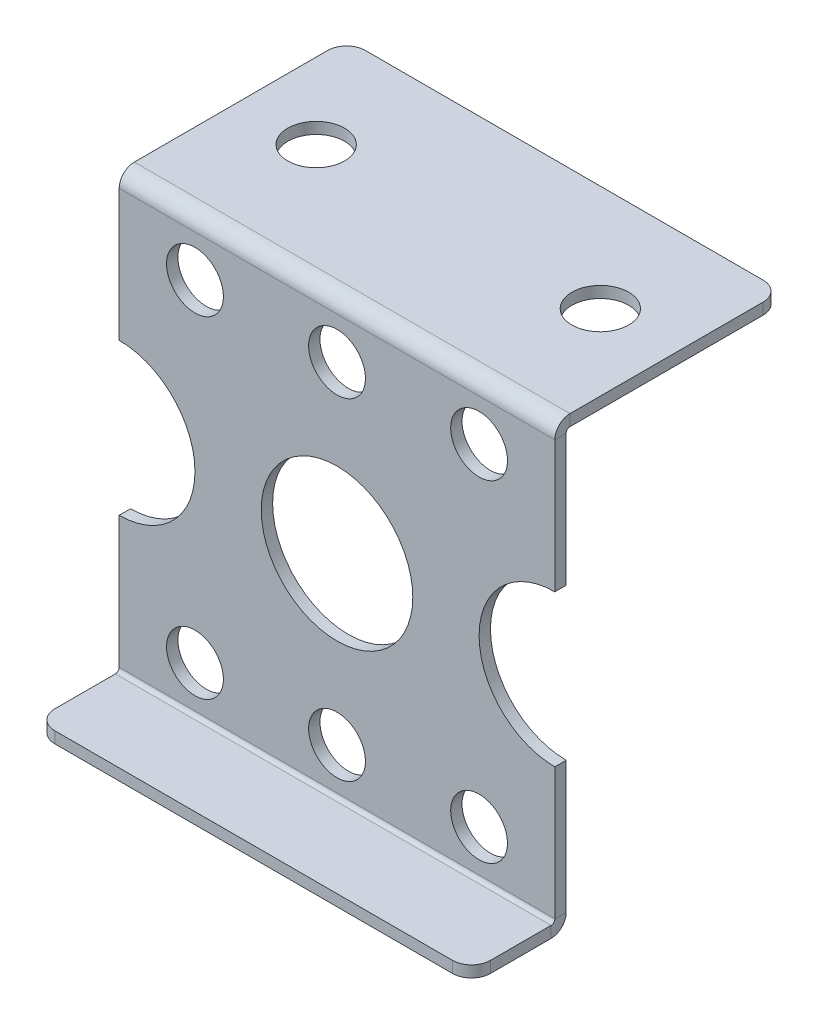
ISO-10303-21;
HEADER;
FILE_DESCRIPTION(('STEP AP214'),'2;1');
FILE_NAME('part.step','',(''),(''),'','','');
FILE_SCHEMA(('AUTOMOTIVE_DESIGN { 1 0 10303 214 1 1 1 1 }'));
ENDSEC;
DATA;
#1=APPLICATION_CONTEXT('core data for automotive mechanical design processes');
#2=APPLICATION_PROTOCOL_DEFINITION('international standard','automotive_design',2000,#1);
#3=PRODUCT_CONTEXT('',#1,'mechanical');
#4=PRODUCT('Part','Part','',(#3));
#5=PRODUCT_RELATED_PRODUCT_CATEGORY('part','',(#4));
#6=PRODUCT_DEFINITION_FORMATION('','',#4);
#7=PRODUCT_DEFINITION_CONTEXT('part definition',#1,'design');
#8=PRODUCT_DEFINITION('design','',#6,#7);
#9=PRODUCT_DEFINITION_SHAPE('','',#8);
#10=(LENGTH_UNIT() NAMED_UNIT(*) SI_UNIT(.MILLI.,.METRE.));
#11=(NAMED_UNIT(*) PLANE_ANGLE_UNIT() SI_UNIT($,.RADIAN.));
#12=(NAMED_UNIT(*) SI_UNIT($,.STERADIAN.) SOLID_ANGLE_UNIT());
#13=UNCERTAINTY_MEASURE_WITH_UNIT(LENGTH_MEASURE(1.E-05),#10,'distance_accuracy_value','');
#14=(GEOMETRIC_REPRESENTATION_CONTEXT(3) GLOBAL_UNCERTAINTY_ASSIGNED_CONTEXT((#13)) GLOBAL_UNIT_ASSIGNED_CONTEXT((#10,
#11,#12)) REPRESENTATION_CONTEXT('',''));
#15=CARTESIAN_POINT('',(0.,0.,0.));
#16=DIRECTION('',(0.,0.,1.));
#17=DIRECTION('',(1.,0.,0.));
#18=AXIS2_PLACEMENT_3D('',#15,#16,#17);
#19=CARTESIAN_POINT('',(11.5,0.,0.6));
#20=DIRECTION('',(0.,0.,1.));
#21=DIRECTION('',(1.,0.,0.));
#22=AXIS2_PLACEMENT_3D('',#19,#20,#21);
#23=PLANE('',#22);
#24=CARTESIAN_POINT('',(7.5,8.75,0.600000000000001));
#25=DIRECTION('',(0.,0.,-1.));
#26=DIRECTION('',(-1.,0.,0.));
#27=AXIS2_PLACEMENT_3D('',#24,#25,#26);
#28=CIRCLE('',#27,1.5);
#29=CARTESIAN_POINT('',(6.,8.75,0.600000000000001));
#30=VERTEX_POINT('',#29);
#31=EDGE_CURVE('E304',#30,#30,#28,.T.);
#32=ORIENTED_EDGE('',*,*,#31,.T.);
#33=EDGE_LOOP('',(#32));
#34=FACE_BOUND('',#33,.T.);
#35=CARTESIAN_POINT('',(0.,8.75,0.600000000000001));
#36=DIRECTION('',(0.,0.,-1.));
#37=DIRECTION('',(-1.,0.,0.));
#38=AXIS2_PLACEMENT_3D('',#35,#36,#37);
#39=CIRCLE('',#38,1.5);
#40=CARTESIAN_POINT('',(-1.5,8.75,0.600000000000001));
#41=VERTEX_POINT('',#40);
#42=EDGE_CURVE('E298',#41,#41,#39,.T.);
#43=ORIENTED_EDGE('',*,*,#42,.T.);
#44=EDGE_LOOP('',(#43));
#45=FACE_BOUND('',#44,.T.);
#46=CARTESIAN_POINT('',(-7.49999999999999,8.75,0.600000000000001));
#47=DIRECTION('',(0.,0.,-1.));
#48=DIRECTION('',(-1.,0.,0.));
#49=AXIS2_PLACEMENT_3D('',#46,#47,#48);
#50=CIRCLE('',#49,1.5);
#51=CARTESIAN_POINT('',(-8.99999999999999,8.75,0.600000000000001));
#52=VERTEX_POINT('',#51);
#53=EDGE_CURVE('E292',#52,#52,#50,.T.);
#54=ORIENTED_EDGE('',*,*,#53,.T.);
#55=EDGE_LOOP('',(#54));
#56=FACE_BOUND('',#55,.T.);
#57=CARTESIAN_POINT('',(-7.49999999999999,-8.75,0.600000000000001));
#58=DIRECTION('',(0.,0.,-1.));
#59=DIRECTION('',(-1.,0.,0.));
#60=AXIS2_PLACEMENT_3D('',#57,#58,#59);
#61=CIRCLE('',#60,1.5);
#62=CARTESIAN_POINT('',(-8.99999999999999,-8.75,0.600000000000001));
#63=VERTEX_POINT('',#62);
#64=EDGE_CURVE('E286',#63,#63,#61,.T.);
#65=ORIENTED_EDGE('',*,*,#64,.T.);
#66=EDGE_LOOP('',(#65));
#67=FACE_BOUND('',#66,.T.);
#68=CARTESIAN_POINT('',(0.,-8.75,0.600000000000001));
#69=DIRECTION('',(0.,0.,-1.));
#70=DIRECTION('',(-1.,0.,0.));
#71=AXIS2_PLACEMENT_3D('',#68,#69,#70);
#72=CIRCLE('',#71,1.5);
#73=CARTESIAN_POINT('',(-1.5,-8.75,0.600000000000001));
#74=VERTEX_POINT('',#73);
#75=EDGE_CURVE('E279',#74,#74,#72,.T.);
#76=ORIENTED_EDGE('',*,*,#75,.T.);
#77=EDGE_LOOP('',(#76));
#78=FACE_BOUND('',#77,.T.);
#79=CARTESIAN_POINT('',(7.5,-8.75,0.600000000000001));
#80=DIRECTION('',(0.,0.,-1.));
#81=DIRECTION('',(-1.,0.,0.));
#82=AXIS2_PLACEMENT_3D('',#79,#80,#81);
#83=CIRCLE('',#82,1.5);
#84=CARTESIAN_POINT('',(6.,-8.75,0.600000000000001));
#85=VERTEX_POINT('',#84);
#86=EDGE_CURVE('E309',#85,#85,#83,.T.);
#87=ORIENTED_EDGE('',*,*,#86,.T.);
#88=EDGE_LOOP('',(#87));
#89=FACE_BOUND('',#88,.T.);
#90=CARTESIAN_POINT('',(0.,0.,0.6));
#91=DIRECTION('',(0.,0.,1.));
#92=DIRECTION('',(1.,0.,0.));
#93=AXIS2_PLACEMENT_3D('',#90,#91,#92);
#94=CIRCLE('',#93,4.);
#95=CARTESIAN_POINT('',(4.,0.,0.6));
#96=VERTEX_POINT('',#95);
#97=EDGE_CURVE('E382',#96,#96,#94,.T.);
#98=ORIENTED_EDGE('',*,*,#97,.F.);
#99=EDGE_LOOP('',(#98));
#100=FACE_BOUND('',#99,.T.);
#101=DIRECTION('',(0.,-1.,0.));
#102=VECTOR('',#101,1.);
#103=CARTESIAN_POINT('',(-11.5,-4.,0.6));
#104=LINE('',#103,#102);
#105=CARTESIAN_POINT('',(-11.5,-4.,0.6));
#106=VERTEX_POINT('',#105);
#107=CARTESIAN_POINT('',(-11.5,-10.95,0.599999999999999));
#108=VERTEX_POINT('',#107);
#109=EDGE_CURVE('E379',#106,#108,#104,.T.);
#110=ORIENTED_EDGE('',*,*,#109,.T.);
#111=DIRECTION('',(1.,0.,0.));
#112=VECTOR('',#111,1.);
#113=CARTESIAN_POINT('',(11.5,-10.95,0.599999999999999));
#114=LINE('',#113,#112);
#115=CARTESIAN_POINT('',(11.5,-10.95,0.599999999999999));
#116=VERTEX_POINT('',#115);
#117=EDGE_CURVE('E269',#116,#108,#114,.F.);
#118=ORIENTED_EDGE('',*,*,#117,.F.);
#119=DIRECTION('',(0.,1.,0.));
#120=VECTOR('',#119,1.);
#121=CARTESIAN_POINT('',(11.5,-4.,0.6));
#122=LINE('',#121,#120);
#123=CARTESIAN_POINT('',(11.5,-4.,0.6));
#124=VERTEX_POINT('',#123);
#125=EDGE_CURVE('E365',#116,#124,#122,.T.);
#126=ORIENTED_EDGE('',*,*,#125,.T.);
#127=CARTESIAN_POINT('',(11.5,0.,0.6));
#128=DIRECTION('',(0.,0.,-1.));
#129=DIRECTION('',(1.,0.,0.));
#130=AXIS2_PLACEMENT_3D('',#127,#128,#129);
#131=CIRCLE('',#130,4.);
#132=CARTESIAN_POINT('',(11.5,4.,0.6));
#133=VERTEX_POINT('',#132);
#134=EDGE_CURVE('E367',#124,#133,#131,.T.);
#135=ORIENTED_EDGE('',*,*,#134,.T.);
#136=DIRECTION('',(0.,1.,0.));
#137=VECTOR('',#136,1.);
#138=CARTESIAN_POINT('',(11.5,11.75,0.6));
#139=LINE('',#138,#137);
#140=CARTESIAN_POINT('',(11.5,10.95,0.600000000000001));
#141=VERTEX_POINT('',#140);
#142=EDGE_CURVE('E371',#133,#141,#139,.T.);
#143=ORIENTED_EDGE('',*,*,#142,.T.);
#144=DIRECTION('',(1.,0.,0.));
#145=VECTOR('',#144,1.);
#146=CARTESIAN_POINT('',(11.5,10.95,0.600000000000001));
#147=LINE('',#146,#145);
#148=CARTESIAN_POINT('',(-11.5,10.95,0.6));
#149=VERTEX_POINT('',#148);
#150=EDGE_CURVE('E342',#141,#149,#147,.F.);
#151=ORIENTED_EDGE('',*,*,#150,.T.);
#152=DIRECTION('',(0.,-1.,0.));
#153=VECTOR('',#152,1.);
#154=CARTESIAN_POINT('',(-11.5,11.75,0.6));
#155=LINE('',#154,#153);
#156=CARTESIAN_POINT('',(-11.5,4.,0.6));
#157=VERTEX_POINT('',#156);
#158=EDGE_CURVE('E374',#149,#157,#155,.T.);
#159=ORIENTED_EDGE('',*,*,#158,.T.);
#160=CARTESIAN_POINT('',(-11.5,0.,0.6));
#161=DIRECTION('',(0.,0.,-1.));
#162=DIRECTION('',(1.,0.,0.));
#163=AXIS2_PLACEMENT_3D('',#160,#161,#162);
#164=CIRCLE('',#163,4.);
#165=EDGE_CURVE('E376',#157,#106,#164,.T.);
#166=ORIENTED_EDGE('',*,*,#165,.T.);
#167=EDGE_LOOP('',(#110,#118,#126,#135,#143,#151,#159,#166));
#168=FACE_BOUND('',#167,.T.);
#169=ADVANCED_FACE('F78',(#34,#45,#56,#67,#78,#89,#100,#168),#23,.T.);
#170=CARTESIAN_POINT('',(11.5,0.,0.));
#171=DIRECTION('',(0.,0.,1.));
#172=DIRECTION('',(1.,0.,0.));
#173=AXIS2_PLACEMENT_3D('',#170,#171,#172);
#174=PLANE('',#173);
#175=CARTESIAN_POINT('',(0.,0.,0.));
#176=DIRECTION('',(0.,0.,1.));
#177=DIRECTION('',(1.,0.,0.));
#178=AXIS2_PLACEMENT_3D('',#175,#176,#177);
#179=CIRCLE('',#178,4.);
#180=CARTESIAN_POINT('',(4.,0.,0.));
#181=VERTEX_POINT('',#180);
#182=EDGE_CURVE('E368',#181,#181,#179,.T.);
#183=ORIENTED_EDGE('',*,*,#182,.T.);
#184=EDGE_LOOP('',(#183));
#185=FACE_BOUND('',#184,.T.);
#186=CARTESIAN_POINT('',(7.5,-8.75,0.));
#187=DIRECTION('',(0.,0.,-1.));
#188=DIRECTION('',(-1.,0.,0.));
#189=AXIS2_PLACEMENT_3D('',#186,#187,#188);
#190=CIRCLE('',#189,1.5);
#191=CARTESIAN_POINT('',(6.,-8.75,0.));
#192=VERTEX_POINT('',#191);
#193=EDGE_CURVE('E282',#192,#192,#190,.T.);
#194=ORIENTED_EDGE('',*,*,#193,.F.);
#195=EDGE_LOOP('',(#194));
#196=FACE_BOUND('',#195,.T.);
#197=CARTESIAN_POINT('',(0.,-8.75,0.));
#198=DIRECTION('',(0.,0.,-1.));
#199=DIRECTION('',(-1.,0.,0.));
#200=AXIS2_PLACEMENT_3D('',#197,#198,#199);
#201=CIRCLE('',#200,1.5);
#202=CARTESIAN_POINT('',(-1.5,-8.75,0.));
#203=VERTEX_POINT('',#202);
#204=EDGE_CURVE('E283',#203,#203,#201,.T.);
#205=ORIENTED_EDGE('',*,*,#204,.F.);
#206=EDGE_LOOP('',(#205));
#207=FACE_BOUND('',#206,.T.);
#208=CARTESIAN_POINT('',(-7.49999999999999,-8.75,0.));
#209=DIRECTION('',(0.,0.,-1.));
#210=DIRECTION('',(-1.,0.,0.));
#211=AXIS2_PLACEMENT_3D('',#208,#209,#210);
#212=CIRCLE('',#211,1.5);
#213=CARTESIAN_POINT('',(-8.99999999999999,-8.75,0.));
#214=VERTEX_POINT('',#213);
#215=EDGE_CURVE('E289',#214,#214,#212,.T.);
#216=ORIENTED_EDGE('',*,*,#215,.F.);
#217=EDGE_LOOP('',(#216));
#218=FACE_BOUND('',#217,.T.);
#219=CARTESIAN_POINT('',(-7.49999999999999,8.75,0.));
#220=DIRECTION('',(0.,0.,-1.));
#221=DIRECTION('',(-1.,0.,0.));
#222=AXIS2_PLACEMENT_3D('',#219,#220,#221);
#223=CIRCLE('',#222,1.5);
#224=CARTESIAN_POINT('',(-8.99999999999999,8.75,0.));
#225=VERTEX_POINT('',#224);
#226=EDGE_CURVE('E295',#225,#225,#223,.T.);
#227=ORIENTED_EDGE('',*,*,#226,.F.);
#228=EDGE_LOOP('',(#227));
#229=FACE_BOUND('',#228,.T.);
#230=CARTESIAN_POINT('',(0.,8.75,0.));
#231=DIRECTION('',(0.,0.,-1.));
#232=DIRECTION('',(-1.,0.,0.));
#233=AXIS2_PLACEMENT_3D('',#230,#231,#232);
#234=CIRCLE('',#233,1.5);
#235=CARTESIAN_POINT('',(-1.5,8.75,0.));
#236=VERTEX_POINT('',#235);
#237=EDGE_CURVE('E301',#236,#236,#234,.T.);
#238=ORIENTED_EDGE('',*,*,#237,.F.);
#239=EDGE_LOOP('',(#238));
#240=FACE_BOUND('',#239,.T.);
#241=CARTESIAN_POINT('',(7.5,8.75,0.));
#242=DIRECTION('',(0.,0.,-1.));
#243=DIRECTION('',(-1.,0.,0.));
#244=AXIS2_PLACEMENT_3D('',#241,#242,#243);
#245=CIRCLE('',#244,1.5);
#246=CARTESIAN_POINT('',(6.,8.75,0.));
#247=VERTEX_POINT('',#246);
#248=EDGE_CURVE('E276',#247,#247,#245,.T.);
#249=ORIENTED_EDGE('',*,*,#248,.F.);
#250=EDGE_LOOP('',(#249));
#251=FACE_BOUND('',#250,.T.);
#252=DIRECTION('',(1.,0.,0.));
#253=VECTOR('',#252,1.);
#254=CARTESIAN_POINT('',(11.5,-10.95,0.));
#255=LINE('',#254,#253);
#256=CARTESIAN_POINT('',(11.5,-10.95,0.));
#257=VERTEX_POINT('',#256);
#258=CARTESIAN_POINT('',(-11.5,-10.95,0.));
#259=VERTEX_POINT('',#258);
#260=EDGE_CURVE('E225',#257,#259,#255,.F.);
#261=ORIENTED_EDGE('',*,*,#260,.T.);
#262=DIRECTION('',(0.,1.,0.));
#263=VECTOR('',#262,1.);
#264=CARTESIAN_POINT('',(-11.5,0.,0.));
#265=LINE('',#264,#263);
#266=CARTESIAN_POINT('',(-11.5,-4.,0.));
#267=VERTEX_POINT('',#266);
#268=EDGE_CURVE('E386',#267,#259,#265,.F.);
#269=ORIENTED_EDGE('',*,*,#268,.F.);
#270=CARTESIAN_POINT('',(-11.5,0.,0.));
#271=DIRECTION('',(0.,0.,-1.));
#272=DIRECTION('',(-1.,0.,0.));
#273=AXIS2_PLACEMENT_3D('',#270,#271,#272);
#274=CIRCLE('',#273,4.);
#275=CARTESIAN_POINT('',(-11.5,4.,0.));
#276=VERTEX_POINT('',#275);
#277=EDGE_CURVE('E389',#276,#267,#274,.T.);
#278=ORIENTED_EDGE('',*,*,#277,.F.);
#279=DIRECTION('',(0.,1.,0.));
#280=VECTOR('',#279,1.);
#281=CARTESIAN_POINT('',(-11.5,0.,0.));
#282=LINE('',#281,#280);
#283=CARTESIAN_POINT('',(-11.5,10.95,0.));
#284=VERTEX_POINT('',#283);
#285=EDGE_CURVE('E392',#284,#276,#282,.F.);
#286=ORIENTED_EDGE('',*,*,#285,.F.);
#287=DIRECTION('',(1.,0.,0.));
#288=VECTOR('',#287,1.);
#289=CARTESIAN_POINT('',(11.5,10.95,0.));
#290=LINE('',#289,#288);
#291=CARTESIAN_POINT('',(11.5,10.95,0.));
#292=VERTEX_POINT('',#291);
#293=EDGE_CURVE('E355',#292,#284,#290,.F.);
#294=ORIENTED_EDGE('',*,*,#293,.F.);
#295=DIRECTION('',(0.,1.,0.));
#296=VECTOR('',#295,1.);
#297=CARTESIAN_POINT('',(11.5,0.,0.));
#298=LINE('',#297,#296);
#299=CARTESIAN_POINT('',(11.5,4.,0.));
#300=VERTEX_POINT('',#299);
#301=EDGE_CURVE('E394',#300,#292,#298,.T.);
#302=ORIENTED_EDGE('',*,*,#301,.F.);
#303=CARTESIAN_POINT('',(11.5,0.,0.));
#304=DIRECTION('',(0.,0.,-1.));
#305=DIRECTION('',(-1.,0.,0.));
#306=AXIS2_PLACEMENT_3D('',#303,#304,#305);
#307=CIRCLE('',#306,4.);
#308=CARTESIAN_POINT('',(11.5,-4.,0.));
#309=VERTEX_POINT('',#308);
#310=EDGE_CURVE('E397',#309,#300,#307,.T.);
#311=ORIENTED_EDGE('',*,*,#310,.F.);
#312=DIRECTION('',(0.,1.,0.));
#313=VECTOR('',#312,1.);
#314=CARTESIAN_POINT('',(11.5,0.,0.));
#315=LINE('',#314,#313);
#316=EDGE_CURVE('E362',#257,#309,#315,.T.);
#317=ORIENTED_EDGE('',*,*,#316,.F.);
#318=EDGE_LOOP('',(#261,#269,#278,#286,#294,#302,#311,#317));
#319=FACE_BOUND('',#318,.T.);
#320=ADVANCED_FACE('F476',(#185,#196,#207,#218,#229,#240,#251,#319),#174,.F.);
#321=CARTESIAN_POINT('',(11.5,-4.,0.6));
#322=DIRECTION('',(1.,0.,0.));
#323=DIRECTION('',(0.,1.,0.));
#324=AXIS2_PLACEMENT_3D('',#321,#322,#323);
#325=PLANE('',#324);
#326=ORIENTED_EDGE('',*,*,#125,.F.);
#327=DIRECTION('',(0.,0.,-1.));
#328=VECTOR('',#327,1.);
#329=CARTESIAN_POINT('',(11.5,-10.95,0.599999999999999));
#330=LINE('',#329,#328);
#331=EDGE_CURVE('E265',#116,#257,#330,.T.);
#332=ORIENTED_EDGE('',*,*,#331,.T.);
#333=ORIENTED_EDGE('',*,*,#316,.T.);
#334=DIRECTION('',(0.,0.,1.));
#335=VECTOR('',#334,1.);
#336=CARTESIAN_POINT('',(11.5,-4.,0.6));
#337=LINE('',#336,#335);
#338=EDGE_CURVE('E409',#309,#124,#337,.T.);
#339=ORIENTED_EDGE('',*,*,#338,.T.);
#340=EDGE_LOOP('',(#326,#332,#333,#339));
#341=FACE_BOUND('',#340,.T.);
#342=ADVANCED_FACE('F481',(#341),#325,.T.);
#343=CARTESIAN_POINT('',(11.5,11.75,0.6));
#344=DIRECTION('',(1.,0.,0.));
#345=DIRECTION('',(0.,1.,0.));
#346=AXIS2_PLACEMENT_3D('',#343,#344,#345);
#347=PLANE('',#346);
#348=ORIENTED_EDGE('',*,*,#301,.T.);
#349=DIRECTION('',(0.,0.,1.));
#350=VECTOR('',#349,1.);
#351=CARTESIAN_POINT('',(11.5,10.95,0.));
#352=LINE('',#351,#350);
#353=EDGE_CURVE('E349',#292,#141,#352,.T.);
#354=ORIENTED_EDGE('',*,*,#353,.T.);
#355=ORIENTED_EDGE('',*,*,#142,.F.);
#356=DIRECTION('',(0.,0.,1.));
#357=VECTOR('',#356,1.);
#358=CARTESIAN_POINT('',(11.5,4.,0.6));
#359=LINE('',#358,#357);
#360=EDGE_CURVE('E407',#300,#133,#359,.T.);
#361=ORIENTED_EDGE('',*,*,#360,.F.);
#362=EDGE_LOOP('',(#348,#354,#355,#361));
#363=FACE_BOUND('',#362,.T.);
#364=ADVANCED_FACE('F486',(#363),#347,.T.);
#365=CARTESIAN_POINT('',(11.5,0.,0.6));
#366=DIRECTION('',(0.,0.,1.));
#367=DIRECTION('',(1.,0.,0.));
#368=AXIS2_PLACEMENT_3D('',#365,#366,#367);
#369=CYLINDRICAL_SURFACE('',#368,4.);
#370=ORIENTED_EDGE('',*,*,#338,.F.);
#371=ORIENTED_EDGE('',*,*,#310,.T.);
#372=ORIENTED_EDGE('',*,*,#360,.T.);
#373=ORIENTED_EDGE('',*,*,#134,.F.);
#374=EDGE_LOOP('',(#370,#371,#372,#373));
#375=FACE_BOUND('',#374,.T.);
#376=ADVANCED_FACE('F564',(#375),#369,.F.);
#377=CARTESIAN_POINT('',(-11.5,11.75,0.6));
#378=DIRECTION('',(-1.,0.,0.));
#379=DIRECTION('',(0.,-1.,0.));
#380=AXIS2_PLACEMENT_3D('',#377,#378,#379);
#381=PLANE('',#380);
#382=DIRECTION('',(0.,0.,1.));
#383=VECTOR('',#382,1.);
#384=CARTESIAN_POINT('',(-11.5,10.95,0.));
#385=LINE('',#384,#383);
#386=EDGE_CURVE('E359',#284,#149,#385,.T.);
#387=ORIENTED_EDGE('',*,*,#386,.F.);
#388=ORIENTED_EDGE('',*,*,#285,.T.);
#389=DIRECTION('',(0.,0.,1.));
#390=VECTOR('',#389,1.);
#391=CARTESIAN_POINT('',(-11.5,4.,0.6));
#392=LINE('',#391,#390);
#393=EDGE_CURVE('E404',#276,#157,#392,.T.);
#394=ORIENTED_EDGE('',*,*,#393,.T.);
#395=ORIENTED_EDGE('',*,*,#158,.F.);
#396=EDGE_LOOP('',(#387,#388,#394,#395));
#397=FACE_BOUND('',#396,.T.);
#398=ADVANCED_FACE('F498',(#397),#381,.T.);
#399=CARTESIAN_POINT('',(-11.5,0.,0.6));
#400=DIRECTION('',(0.,0.,1.));
#401=DIRECTION('',(1.,0.,0.));
#402=AXIS2_PLACEMENT_3D('',#399,#400,#401);
#403=CYLINDRICAL_SURFACE('',#402,4.);
#404=ORIENTED_EDGE('',*,*,#393,.F.);
#405=ORIENTED_EDGE('',*,*,#277,.T.);
#406=DIRECTION('',(0.,0.,1.));
#407=VECTOR('',#406,1.);
#408=CARTESIAN_POINT('',(-11.5,-4.,0.6));
#409=LINE('',#408,#407);
#410=EDGE_CURVE('E385',#267,#106,#409,.T.);
#411=ORIENTED_EDGE('',*,*,#410,.T.);
#412=ORIENTED_EDGE('',*,*,#165,.F.);
#413=EDGE_LOOP('',(#404,#405,#411,#412));
#414=FACE_BOUND('',#413,.T.);
#415=ADVANCED_FACE('F472',(#414),#403,.F.);
#416=CARTESIAN_POINT('',(-11.5,-4.,0.6));
#417=DIRECTION('',(-1.,0.,0.));
#418=DIRECTION('',(0.,-1.,0.));
#419=AXIS2_PLACEMENT_3D('',#416,#417,#418);
#420=PLANE('',#419);
#421=DIRECTION('',(0.,0.,-1.));
#422=VECTOR('',#421,1.);
#423=CARTESIAN_POINT('',(-11.5,-10.95,0.599999999999999));
#424=LINE('',#423,#422);
#425=EDGE_CURVE('E273',#108,#259,#424,.T.);
#426=ORIENTED_EDGE('',*,*,#425,.F.);
#427=ORIENTED_EDGE('',*,*,#109,.F.);
#428=ORIENTED_EDGE('',*,*,#410,.F.);
#429=ORIENTED_EDGE('',*,*,#268,.T.);
#430=EDGE_LOOP('',(#426,#427,#428,#429));
#431=FACE_BOUND('',#430,.T.);
#432=ADVANCED_FACE('F464',(#431),#420,.T.);
#433=CARTESIAN_POINT('',(0.,0.,0.6));
#434=DIRECTION('',(0.,0.,1.));
#435=DIRECTION('',(1.,0.,0.));
#436=AXIS2_PLACEMENT_3D('',#433,#434,#435);
#437=CYLINDRICAL_SURFACE('',#436,4.);
#438=ORIENTED_EDGE('',*,*,#97,.T.);
#439=EDGE_LOOP('',(#438));
#440=FACE_BOUND('',#439,.T.);
#441=ORIENTED_EDGE('',*,*,#182,.F.);
#442=EDGE_LOOP('',(#441));
#443=FACE_BOUND('',#442,.T.);
#444=ADVANCED_FACE('F559',(#440,#443),#437,.F.);
#445=CARTESIAN_POINT('',(-11.5,10.95,-0.199999999999999));
#446=DIRECTION('',(-1.,0.,0.));
#447=DIRECTION('',(0.,0.,1.));
#448=AXIS2_PLACEMENT_3D('',#445,#446,#447);
#449=PLANE('',#448);
#450=DIRECTION('',(0.,-1.,0.));
#451=VECTOR('',#450,1.);
#452=CARTESIAN_POINT('',(-11.5,11.75,-0.199999999999997));
#453=LINE('',#452,#451);
#454=CARTESIAN_POINT('',(-11.5,11.15,-0.199999999999999));
#455=VERTEX_POINT('',#454);
#456=CARTESIAN_POINT('',(-11.5,11.75,-0.199999999999997));
#457=VERTEX_POINT('',#456);
#458=EDGE_CURVE('E312',#455,#457,#453,.F.);
#459=ORIENTED_EDGE('',*,*,#458,.F.);
#460=CARTESIAN_POINT('',(-11.5,10.95,-0.199999999999999));
#461=DIRECTION('',(1.,0.,0.));
#462=DIRECTION('',(0.,0.,-1.));
#463=AXIS2_PLACEMENT_3D('',#460,#461,#462);
#464=CIRCLE('',#463,0.200000000000001);
#465=EDGE_CURVE('E352',#284,#455,#464,.F.);
#466=ORIENTED_EDGE('',*,*,#465,.F.);
#467=ORIENTED_EDGE('',*,*,#386,.T.);
#468=CARTESIAN_POINT('',(-11.5,10.95,-0.199999999999999));
#469=DIRECTION('',(1.,0.,0.));
#470=DIRECTION('',(0.,0.,-1.));
#471=AXIS2_PLACEMENT_3D('',#468,#469,#470);
#472=CIRCLE('',#471,0.8);
#473=EDGE_CURVE('E345',#149,#457,#472,.F.);
#474=ORIENTED_EDGE('',*,*,#473,.T.);
#475=EDGE_LOOP('',(#459,#466,#467,#474));
#476=FACE_BOUND('',#475,.T.);
#477=ADVANCED_FACE('F501',(#476),#449,.T.);
#478=CARTESIAN_POINT('',(11.5,10.95,-0.199999999999999));
#479=DIRECTION('',(-1.,0.,0.));
#480=DIRECTION('',(0.,0.,1.));
#481=AXIS2_PLACEMENT_3D('',#478,#479,#480);
#482=PLANE('',#481);
#483=CARTESIAN_POINT('',(11.5,10.95,-0.199999999999999));
#484=DIRECTION('',(1.,0.,0.));
#485=DIRECTION('',(0.,0.,-1.));
#486=AXIS2_PLACEMENT_3D('',#483,#484,#485);
#487=CIRCLE('',#486,0.200000000000001);
#488=CARTESIAN_POINT('',(11.5,11.15,-0.199999999999999));
#489=VERTEX_POINT('',#488);
#490=EDGE_CURVE('E317',#489,#292,#487,.T.);
#491=ORIENTED_EDGE('',*,*,#490,.F.);
#492=DIRECTION('',(0.,-1.,0.));
#493=VECTOR('',#492,1.);
#494=CARTESIAN_POINT('',(11.5,11.15,-0.199999999999999));
#495=LINE('',#494,#493);
#496=CARTESIAN_POINT('',(11.5,11.75,-0.199999999999997));
#497=VERTEX_POINT('',#496);
#498=EDGE_CURVE('E335',#489,#497,#495,.F.);
#499=ORIENTED_EDGE('',*,*,#498,.T.);
#500=CARTESIAN_POINT('',(11.5,10.95,-0.199999999999999));
#501=DIRECTION('',(1.,0.,0.));
#502=DIRECTION('',(0.,0.,-1.));
#503=AXIS2_PLACEMENT_3D('',#500,#501,#502);
#504=CIRCLE('',#503,0.8);
#505=EDGE_CURVE('E346',#497,#141,#504,.T.);
#506=ORIENTED_EDGE('',*,*,#505,.T.);
#507=ORIENTED_EDGE('',*,*,#353,.F.);
#508=EDGE_LOOP('',(#491,#499,#506,#507));
#509=FACE_BOUND('',#508,.T.);
#510=ADVANCED_FACE('F489',(#509),#482,.F.);
#511=CARTESIAN_POINT('',(11.5,10.95,-0.199999999999999));
#512=DIRECTION('',(1.,0.,0.));
#513=DIRECTION('',(0.,1.,0.));
#514=AXIS2_PLACEMENT_3D('',#511,#512,#513);
#515=CYLINDRICAL_SURFACE('',#514,0.8);
#516=ORIENTED_EDGE('',*,*,#150,.F.);
#517=ORIENTED_EDGE('',*,*,#505,.F.);
#518=DIRECTION('',(1.,0.,0.));
#519=VECTOR('',#518,1.);
#520=CARTESIAN_POINT('',(-11.5,11.75,-0.199999999999997));
#521=LINE('',#520,#519);
#522=EDGE_CURVE('E332',#497,#457,#521,.F.);
#523=ORIENTED_EDGE('',*,*,#522,.T.);
#524=ORIENTED_EDGE('',*,*,#473,.F.);
#525=EDGE_LOOP('',(#516,#517,#523,#524));
#526=FACE_BOUND('',#525,.T.);
#527=ADVANCED_FACE('F503',(#526),#515,.T.);
#528=CARTESIAN_POINT('',(11.5,10.95,-0.199999999999999));
#529=DIRECTION('',(1.,0.,0.));
#530=DIRECTION('',(0.,1.,0.));
#531=AXIS2_PLACEMENT_3D('',#528,#529,#530);
#532=CYLINDRICAL_SURFACE('',#531,0.200000000000001);
#533=ORIENTED_EDGE('',*,*,#293,.T.);
#534=ORIENTED_EDGE('',*,*,#465,.T.);
#535=DIRECTION('',(1.,0.,0.));
#536=VECTOR('',#535,1.);
#537=CARTESIAN_POINT('',(-11.5,11.15,-0.199999999999999));
#538=LINE('',#537,#536);
#539=EDGE_CURVE('E338',#455,#489,#538,.T.);
#540=ORIENTED_EDGE('',*,*,#539,.T.);
#541=ORIENTED_EDGE('',*,*,#490,.T.);
#542=EDGE_LOOP('',(#533,#534,#540,#541));
#543=FACE_BOUND('',#542,.T.);
#544=ADVANCED_FACE('F493',(#543),#532,.F.);
#545=CARTESIAN_POINT('',(11.5,11.75,-11.4));
#546=DIRECTION('',(-1.,0.,0.));
#547=DIRECTION('',(0.,0.,1.));
#548=AXIS2_PLACEMENT_3D('',#545,#546,#547);
#549=PLANE('',#548);
#550=DIRECTION('',(0.,0.,1.));
#551=VECTOR('',#550,1.);
#552=CARTESIAN_POINT('',(11.5,11.15,-11.4));
#553=LINE('',#552,#551);
#554=CARTESIAN_POINT('',(11.5,11.15,-10.4));
#555=VERTEX_POINT('',#554);
#556=EDGE_CURVE('E329',#489,#555,#553,.F.);
#557=ORIENTED_EDGE('',*,*,#556,.T.);
#558=DIRECTION('',(0.,-1.,0.));
#559=VECTOR('',#558,1.);
#560=CARTESIAN_POINT('',(11.5,11.75,-10.4));
#561=LINE('',#560,#559);
#562=CARTESIAN_POINT('',(11.5,11.75,-10.4));
#563=VERTEX_POINT('',#562);
#564=EDGE_CURVE('E421',#555,#563,#561,.F.);
#565=ORIENTED_EDGE('',*,*,#564,.T.);
#566=DIRECTION('',(0.,0.,-1.));
#567=VECTOR('',#566,1.);
#568=CARTESIAN_POINT('',(11.5,11.75,0.));
#569=LINE('',#568,#567);
#570=EDGE_CURVE('E321',#497,#563,#569,.T.);
#571=ORIENTED_EDGE('',*,*,#570,.F.);
#572=ORIENTED_EDGE('',*,*,#498,.F.);
#573=EDGE_LOOP('',(#557,#565,#571,#572));
#574=FACE_BOUND('',#573,.T.);
#575=ADVANCED_FACE('F511',(#574),#549,.F.);
#576=CARTESIAN_POINT('',(-11.5,11.75,0.));
#577=DIRECTION('',(1.,0.,0.));
#578=DIRECTION('',(0.,0.,-1.));
#579=AXIS2_PLACEMENT_3D('',#576,#577,#578);
#580=PLANE('',#579);
#581=DIRECTION('',(0.,0.,1.));
#582=VECTOR('',#581,1.);
#583=CARTESIAN_POINT('',(-11.5,11.75,0.));
#584=LINE('',#583,#582);
#585=CARTESIAN_POINT('',(-11.5,11.75,-10.4));
#586=VERTEX_POINT('',#585);
#587=EDGE_CURVE('E315',#586,#457,#584,.T.);
#588=ORIENTED_EDGE('',*,*,#587,.F.);
#589=DIRECTION('',(0.,-1.,0.));
#590=VECTOR('',#589,1.);
#591=CARTESIAN_POINT('',(-11.5,11.75,-10.4));
#592=LINE('',#591,#590);
#593=CARTESIAN_POINT('',(-11.5,11.15,-10.4));
#594=VERTEX_POINT('',#593);
#595=EDGE_CURVE('E427',#586,#594,#592,.T.);
#596=ORIENTED_EDGE('',*,*,#595,.T.);
#597=DIRECTION('',(0.,0.,-1.));
#598=VECTOR('',#597,1.);
#599=CARTESIAN_POINT('',(-11.5,11.15,0.));
#600=LINE('',#599,#598);
#601=EDGE_CURVE('E324',#594,#455,#600,.F.);
#602=ORIENTED_EDGE('',*,*,#601,.T.);
#603=ORIENTED_EDGE('',*,*,#458,.T.);
#604=EDGE_LOOP('',(#588,#596,#602,#603));
#605=FACE_BOUND('',#604,.T.);
#606=ADVANCED_FACE('F527',(#605),#580,.F.);
#607=CARTESIAN_POINT('',(0.,11.75,0.));
#608=DIRECTION('',(0.,-1.,0.));
#609=DIRECTION('',(0.,0.,-1.));
#610=AXIS2_PLACEMENT_3D('',#607,#608,#609);
#611=PLANE('',#610);
#612=CARTESIAN_POINT('',(7.5,11.7500000000001,-5.80000000000001));
#613=DIRECTION('',(0.,-1.,0.));
#614=DIRECTION('',(0.,0.,-1.));
#615=AXIS2_PLACEMENT_3D('',#612,#613,#614);
#616=CIRCLE('',#615,1.5);
#617=CARTESIAN_POINT('',(7.5,11.7500000000001,-7.30000000000001));
#618=VERTEX_POINT('',#617);
#619=EDGE_CURVE('E262',#618,#618,#616,.T.);
#620=ORIENTED_EDGE('',*,*,#619,.T.);
#621=EDGE_LOOP('',(#620));
#622=FACE_BOUND('',#621,.T.);
#623=CARTESIAN_POINT('',(-7.5,11.7500000000001,-5.80000000000001));
#624=DIRECTION('',(0.,-1.,0.));
#625=DIRECTION('',(0.,0.,1.));
#626=AXIS2_PLACEMENT_3D('',#623,#624,#625);
#627=CIRCLE('',#626,1.5);
#628=CARTESIAN_POINT('',(-7.5,11.7500000000001,-4.30000000000001));
#629=VERTEX_POINT('',#628);
#630=EDGE_CURVE('E993',#629,#629,#627,.T.);
#631=ORIENTED_EDGE('',*,*,#630,.T.);
#632=EDGE_LOOP('',(#631));
#633=FACE_BOUND('',#632,.T.);
#634=ORIENTED_EDGE('',*,*,#570,.T.);
#635=CARTESIAN_POINT('',(10.5,11.75,-10.4));
#636=DIRECTION('',(0.,-1.,0.));
#637=DIRECTION('',(0.,0.,-1.));
#638=AXIS2_PLACEMENT_3D('',#635,#636,#637);
#639=CIRCLE('',#638,1.);
#640=CARTESIAN_POINT('',(10.5,11.75,-11.4));
#641=VERTEX_POINT('',#640);
#642=EDGE_CURVE('E425',#563,#641,#639,.F.);
#643=ORIENTED_EDGE('',*,*,#642,.T.);
#644=DIRECTION('',(-1.,0.,0.));
#645=VECTOR('',#644,1.);
#646=CARTESIAN_POINT('',(0.,11.75,-11.4));
#647=LINE('',#646,#645);
#648=CARTESIAN_POINT('',(-10.5,11.75,-11.4));
#649=VERTEX_POINT('',#648);
#650=EDGE_CURVE('E318',#641,#649,#647,.T.);
#651=ORIENTED_EDGE('',*,*,#650,.T.);
#652=CARTESIAN_POINT('',(-10.5,11.75,-10.4));
#653=DIRECTION('',(0.,-1.,0.));
#654=DIRECTION('',(0.,0.,-1.));
#655=AXIS2_PLACEMENT_3D('',#652,#653,#654);
#656=CIRCLE('',#655,1.);
#657=EDGE_CURVE('E423',#649,#586,#656,.F.);
#658=ORIENTED_EDGE('',*,*,#657,.T.);
#659=ORIENTED_EDGE('',*,*,#587,.T.);
#660=ORIENTED_EDGE('',*,*,#522,.F.);
#661=EDGE_LOOP('',(#634,#643,#651,#658,#659,#660));
#662=FACE_BOUND('',#661,.T.);
#663=ADVANCED_FACE('F507',(#622,#633,#662),#611,.F.);
#664=CARTESIAN_POINT('',(0.,11.15,0.));
#665=DIRECTION('',(0.,-1.,0.));
#666=DIRECTION('',(0.,0.,-1.));
#667=AXIS2_PLACEMENT_3D('',#664,#665,#666);
#668=PLANE('',#667);
#669=CARTESIAN_POINT('',(7.5,11.15,-5.80000000000001));
#670=DIRECTION('',(0.,-1.,0.));
#671=DIRECTION('',(0.,0.,-1.));
#672=AXIS2_PLACEMENT_3D('',#669,#670,#671);
#673=CIRCLE('',#672,1.5);
#674=CARTESIAN_POINT('',(7.5,11.15,-7.30000000000001));
#675=VERTEX_POINT('',#674);
#676=EDGE_CURVE('E998',#675,#675,#673,.T.);
#677=ORIENTED_EDGE('',*,*,#676,.F.);
#678=EDGE_LOOP('',(#677));
#679=FACE_BOUND('',#678,.T.);
#680=CARTESIAN_POINT('',(-7.5,11.15,-5.80000000000001));
#681=DIRECTION('',(0.,-1.,0.));
#682=DIRECTION('',(0.,0.,1.));
#683=AXIS2_PLACEMENT_3D('',#680,#681,#682);
#684=CIRCLE('',#683,1.5);
#685=CARTESIAN_POINT('',(-7.5,11.15,-4.30000000000001));
#686=VERTEX_POINT('',#685);
#687=EDGE_CURVE('E996',#686,#686,#684,.T.);
#688=ORIENTED_EDGE('',*,*,#687,.F.);
#689=EDGE_LOOP('',(#688));
#690=FACE_BOUND('',#689,.T.);
#691=DIRECTION('',(1.,0.,0.));
#692=VECTOR('',#691,1.);
#693=CARTESIAN_POINT('',(-11.5,11.15,-11.4));
#694=LINE('',#693,#692);
#695=CARTESIAN_POINT('',(10.5,11.15,-11.4));
#696=VERTEX_POINT('',#695);
#697=CARTESIAN_POINT('',(-10.5,11.15,-11.4));
#698=VERTEX_POINT('',#697);
#699=EDGE_CURVE('E326',#696,#698,#694,.F.);
#700=ORIENTED_EDGE('',*,*,#699,.F.);
#701=CARTESIAN_POINT('',(10.5,11.15,-10.4));
#702=DIRECTION('',(0.,-1.,0.));
#703=DIRECTION('',(0.,0.,-1.));
#704=AXIS2_PLACEMENT_3D('',#701,#702,#703);
#705=CIRCLE('',#704,1.);
#706=EDGE_CURVE('E419',#696,#555,#705,.T.);
#707=ORIENTED_EDGE('',*,*,#706,.T.);
#708=ORIENTED_EDGE('',*,*,#556,.F.);
#709=ORIENTED_EDGE('',*,*,#539,.F.);
#710=ORIENTED_EDGE('',*,*,#601,.F.);
#711=CARTESIAN_POINT('',(-10.5,11.15,-10.4));
#712=DIRECTION('',(0.,-1.,0.));
#713=DIRECTION('',(0.,0.,-1.));
#714=AXIS2_PLACEMENT_3D('',#711,#712,#713);
#715=CIRCLE('',#714,1.);
#716=EDGE_CURVE('E417',#594,#698,#715,.T.);
#717=ORIENTED_EDGE('',*,*,#716,.T.);
#718=EDGE_LOOP('',(#700,#707,#708,#709,#710,#717));
#719=FACE_BOUND('',#718,.T.);
#720=ADVANCED_FACE('F530',(#679,#690,#719),#668,.T.);
#721=CARTESIAN_POINT('',(-11.5,11.75,-11.4));
#722=DIRECTION('',(0.,0.,1.));
#723=DIRECTION('',(0.,-1.,0.));
#724=AXIS2_PLACEMENT_3D('',#721,#722,#723);
#725=PLANE('',#724);
#726=ORIENTED_EDGE('',*,*,#650,.F.);
#727=DIRECTION('',(0.,-1.,0.));
#728=VECTOR('',#727,1.);
#729=CARTESIAN_POINT('',(10.5,11.75,-11.4));
#730=LINE('',#729,#728);
#731=EDGE_CURVE('E414',#641,#696,#730,.T.);
#732=ORIENTED_EDGE('',*,*,#731,.T.);
#733=ORIENTED_EDGE('',*,*,#699,.T.);
#734=DIRECTION('',(0.,-1.,0.));
#735=VECTOR('',#734,1.);
#736=CARTESIAN_POINT('',(-10.5,11.75,-11.4));
#737=LINE('',#736,#735);
#738=EDGE_CURVE('E412',#698,#649,#737,.F.);
#739=ORIENTED_EDGE('',*,*,#738,.T.);
#740=EDGE_LOOP('',(#726,#732,#733,#739));
#741=FACE_BOUND('',#740,.T.);
#742=ADVANCED_FACE('F520',(#741),#725,.F.);
#743=CARTESIAN_POINT('',(7.5,-8.75,0.600000000000001));
#744=DIRECTION('',(0.,0.,-1.));
#745=DIRECTION('',(-1.,0.,0.));
#746=AXIS2_PLACEMENT_3D('',#743,#744,#745);
#747=CYLINDRICAL_SURFACE('',#746,1.5);
#748=ORIENTED_EDGE('',*,*,#86,.F.);
#749=EDGE_LOOP('',(#748));
#750=FACE_BOUND('',#749,.T.);
#751=ORIENTED_EDGE('',*,*,#193,.T.);
#752=EDGE_LOOP('',(#751));
#753=FACE_BOUND('',#752,.T.);
#754=ADVANCED_FACE('F538',(#750,#753),#747,.F.);
#755=CARTESIAN_POINT('',(0.,-8.75,0.600000000000001));
#756=DIRECTION('',(0.,0.,-1.));
#757=DIRECTION('',(-1.,0.,0.));
#758=AXIS2_PLACEMENT_3D('',#755,#756,#757);
#759=CYLINDRICAL_SURFACE('',#758,1.5);
#760=ORIENTED_EDGE('',*,*,#75,.F.);
#761=EDGE_LOOP('',(#760));
#762=FACE_BOUND('',#761,.T.);
#763=ORIENTED_EDGE('',*,*,#204,.T.);
#764=EDGE_LOOP('',(#763));
#765=FACE_BOUND('',#764,.T.);
#766=ADVANCED_FACE('F813',(#762,#765),#759,.F.);
#767=CARTESIAN_POINT('',(-7.49999999999999,-8.75,0.600000000000001));
#768=DIRECTION('',(0.,0.,-1.));
#769=DIRECTION('',(-1.,0.,0.));
#770=AXIS2_PLACEMENT_3D('',#767,#768,#769);
#771=CYLINDRICAL_SURFACE('',#770,1.5);
#772=ORIENTED_EDGE('',*,*,#64,.F.);
#773=EDGE_LOOP('',(#772));
#774=FACE_BOUND('',#773,.T.);
#775=ORIENTED_EDGE('',*,*,#215,.T.);
#776=EDGE_LOOP('',(#775));
#777=FACE_BOUND('',#776,.T.);
#778=ADVANCED_FACE('F802',(#774,#777),#771,.F.);
#779=CARTESIAN_POINT('',(-7.49999999999999,8.75,0.600000000000001));
#780=DIRECTION('',(0.,0.,-1.));
#781=DIRECTION('',(-1.,0.,0.));
#782=AXIS2_PLACEMENT_3D('',#779,#780,#781);
#783=CYLINDRICAL_SURFACE('',#782,1.5);
#784=ORIENTED_EDGE('',*,*,#53,.F.);
#785=EDGE_LOOP('',(#784));
#786=FACE_BOUND('',#785,.T.);
#787=ORIENTED_EDGE('',*,*,#226,.T.);
#788=EDGE_LOOP('',(#787));
#789=FACE_BOUND('',#788,.T.);
#790=ADVANCED_FACE('F791',(#786,#789),#783,.F.);
#791=CARTESIAN_POINT('',(0.,8.75,0.600000000000001));
#792=DIRECTION('',(0.,0.,-1.));
#793=DIRECTION('',(-1.,0.,0.));
#794=AXIS2_PLACEMENT_3D('',#791,#792,#793);
#795=CYLINDRICAL_SURFACE('',#794,1.5);
#796=ORIENTED_EDGE('',*,*,#42,.F.);
#797=EDGE_LOOP('',(#796));
#798=FACE_BOUND('',#797,.T.);
#799=ORIENTED_EDGE('',*,*,#237,.T.);
#800=EDGE_LOOP('',(#799));
#801=FACE_BOUND('',#800,.T.);
#802=ADVANCED_FACE('F780',(#798,#801),#795,.F.);
#803=CARTESIAN_POINT('',(7.5,8.75,0.600000000000001));
#804=DIRECTION('',(0.,0.,-1.));
#805=DIRECTION('',(-1.,0.,0.));
#806=AXIS2_PLACEMENT_3D('',#803,#804,#805);
#807=CYLINDRICAL_SURFACE('',#806,1.5);
#808=ORIENTED_EDGE('',*,*,#31,.F.);
#809=EDGE_LOOP('',(#808));
#810=FACE_BOUND('',#809,.T.);
#811=ORIENTED_EDGE('',*,*,#248,.T.);
#812=EDGE_LOOP('',(#811));
#813=FACE_BOUND('',#812,.T.);
#814=ADVANCED_FACE('F742',(#810,#813),#807,.F.);
#815=CARTESIAN_POINT('',(-11.5,-10.95,0.799999999999999));
#816=DIRECTION('',(-1.,0.,0.));
#817=DIRECTION('',(0.,0.,1.));
#818=AXIS2_PLACEMENT_3D('',#815,#816,#817);
#819=PLANE('',#818);
#820=DIRECTION('',(0.,1.,0.));
#821=VECTOR('',#820,1.);
#822=CARTESIAN_POINT('',(-11.5,-11.75,0.799999999999997));
#823=LINE('',#822,#821);
#824=CARTESIAN_POINT('',(-11.5,-11.15,0.799999999999998));
#825=VERTEX_POINT('',#824);
#826=CARTESIAN_POINT('',(-11.5,-11.75,0.799999999999996));
#827=VERTEX_POINT('',#826);
#828=EDGE_CURVE('E259',#825,#827,#823,.F.);
#829=ORIENTED_EDGE('',*,*,#828,.F.);
#830=CARTESIAN_POINT('',(-11.5,-10.95,0.799999999999999));
#831=DIRECTION('',(1.,0.,0.));
#832=DIRECTION('',(0.,0.,-1.));
#833=AXIS2_PLACEMENT_3D('',#830,#831,#832);
#834=CIRCLE('',#833,0.200000000000001);
#835=EDGE_CURVE('E228',#108,#825,#834,.F.);
#836=ORIENTED_EDGE('',*,*,#835,.F.);
#837=ORIENTED_EDGE('',*,*,#425,.T.);
#838=CARTESIAN_POINT('',(-11.5,-10.95,0.799999999999999));
#839=DIRECTION('',(1.,0.,0.));
#840=DIRECTION('',(0.,0.,-1.));
#841=AXIS2_PLACEMENT_3D('',#838,#839,#840);
#842=CIRCLE('',#841,0.8);
#843=EDGE_CURVE('E264',#259,#827,#842,.F.);
#844=ORIENTED_EDGE('',*,*,#843,.T.);
#845=EDGE_LOOP('',(#829,#836,#837,#844));
#846=FACE_BOUND('',#845,.T.);
#847=ADVANCED_FACE('F461',(#846),#819,.T.);
#848=CARTESIAN_POINT('',(11.5,-10.95,0.799999999999999));
#849=DIRECTION('',(-1.,0.,0.));
#850=DIRECTION('',(0.,0.,1.));
#851=AXIS2_PLACEMENT_3D('',#848,#849,#850);
#852=PLANE('',#851);
#853=CARTESIAN_POINT('',(11.5,-10.95,0.799999999999999));
#854=DIRECTION('',(1.,0.,0.));
#855=DIRECTION('',(0.,0.,-1.));
#856=AXIS2_PLACEMENT_3D('',#853,#854,#855);
#857=CIRCLE('',#856,0.200000000000001);
#858=CARTESIAN_POINT('',(11.5,-11.15,0.799999999999998));
#859=VERTEX_POINT('',#858);
#860=EDGE_CURVE('E235',#859,#116,#857,.T.);
#861=ORIENTED_EDGE('',*,*,#860,.F.);
#862=DIRECTION('',(0.,1.,0.));
#863=VECTOR('',#862,1.);
#864=CARTESIAN_POINT('',(11.5,-11.15,0.799999999999999));
#865=LINE('',#864,#863);
#866=CARTESIAN_POINT('',(11.5,-11.75,0.799999999999997));
#867=VERTEX_POINT('',#866);
#868=EDGE_CURVE('E232',#859,#867,#865,.F.);
#869=ORIENTED_EDGE('',*,*,#868,.T.);
#870=CARTESIAN_POINT('',(11.5,-10.95,0.799999999999999));
#871=DIRECTION('',(1.,0.,0.));
#872=DIRECTION('',(0.,0.,-1.));
#873=AXIS2_PLACEMENT_3D('',#870,#871,#872);
#874=CIRCLE('',#873,0.8);
#875=EDGE_CURVE('E218',#867,#257,#874,.T.);
#876=ORIENTED_EDGE('',*,*,#875,.T.);
#877=ORIENTED_EDGE('',*,*,#331,.F.);
#878=EDGE_LOOP('',(#861,#869,#876,#877));
#879=FACE_BOUND('',#878,.T.);
#880=ADVANCED_FACE('F233',(#879),#852,.F.);
#881=CARTESIAN_POINT('',(11.5,-10.95,0.799999999999999));
#882=DIRECTION('',(1.,0.,0.));
#883=DIRECTION('',(0.,-1.,0.));
#884=AXIS2_PLACEMENT_3D('',#881,#882,#883);
#885=CYLINDRICAL_SURFACE('',#884,0.8);
#886=ORIENTED_EDGE('',*,*,#260,.F.);
#887=ORIENTED_EDGE('',*,*,#875,.F.);
#888=DIRECTION('',(1.,0.,0.));
#889=VECTOR('',#888,1.);
#890=CARTESIAN_POINT('',(-11.5,-11.75,0.799999999999997));
#891=LINE('',#890,#889);
#892=EDGE_CURVE('E223',#867,#827,#891,.F.);
#893=ORIENTED_EDGE('',*,*,#892,.T.);
#894=ORIENTED_EDGE('',*,*,#843,.F.);
#895=EDGE_LOOP('',(#886,#887,#893,#894));
#896=FACE_BOUND('',#895,.T.);
#897=ADVANCED_FACE('F220',(#896),#885,.T.);
#898=CARTESIAN_POINT('',(11.5,-10.95,0.799999999999999));
#899=DIRECTION('',(1.,0.,0.));
#900=DIRECTION('',(0.,-1.,0.));
#901=AXIS2_PLACEMENT_3D('',#898,#899,#900);
#902=CYLINDRICAL_SURFACE('',#901,0.200000000000001);
#903=ORIENTED_EDGE('',*,*,#117,.T.);
#904=ORIENTED_EDGE('',*,*,#835,.T.);
#905=DIRECTION('',(1.,0.,0.));
#906=VECTOR('',#905,1.);
#907=CARTESIAN_POINT('',(-11.5,-11.15,0.799999999999999));
#908=LINE('',#907,#906);
#909=EDGE_CURVE('E237',#825,#859,#908,.T.);
#910=ORIENTED_EDGE('',*,*,#909,.T.);
#911=ORIENTED_EDGE('',*,*,#860,.T.);
#912=EDGE_LOOP('',(#903,#904,#910,#911));
#913=FACE_BOUND('',#912,.T.);
#914=ADVANCED_FACE('F458',(#913),#902,.F.);
#915=CARTESIAN_POINT('',(11.5,-11.75,5.));
#916=DIRECTION('',(-1.,0.,0.));
#917=DIRECTION('',(0.,0.,1.));
#918=AXIS2_PLACEMENT_3D('',#915,#916,#917);
#919=PLANE('',#918);
#920=DIRECTION('',(0.,0.,-1.));
#921=VECTOR('',#920,1.);
#922=CARTESIAN_POINT('',(11.5,-11.15,5.));
#923=LINE('',#922,#921);
#924=CARTESIAN_POINT('',(11.5,-11.15,4.));
#925=VERTEX_POINT('',#924);
#926=EDGE_CURVE('E245',#859,#925,#923,.F.);
#927=ORIENTED_EDGE('',*,*,#926,.T.);
#928=DIRECTION('',(0.,1.,0.));
#929=VECTOR('',#928,1.);
#930=CARTESIAN_POINT('',(11.5,-11.75,4.));
#931=LINE('',#930,#929);
#932=CARTESIAN_POINT('',(11.5,-11.75,4.));
#933=VERTEX_POINT('',#932);
#934=EDGE_CURVE('E13',#925,#933,#931,.F.);
#935=ORIENTED_EDGE('',*,*,#934,.T.);
#936=DIRECTION('',(0.,0.,1.));
#937=VECTOR('',#936,1.);
#938=CARTESIAN_POINT('',(11.5,-11.75,0.));
#939=LINE('',#938,#937);
#940=EDGE_CURVE('E241',#867,#933,#939,.T.);
#941=ORIENTED_EDGE('',*,*,#940,.F.);
#942=ORIENTED_EDGE('',*,*,#868,.F.);
#943=EDGE_LOOP('',(#927,#935,#941,#942));
#944=FACE_BOUND('',#943,.T.);
#945=ADVANCED_FACE('F247',(#944),#919,.F.);
#946=CARTESIAN_POINT('',(-11.5,-11.75,0.599999999999998));
#947=DIRECTION('',(1.,0.,0.));
#948=DIRECTION('',(0.,0.,-1.));
#949=AXIS2_PLACEMENT_3D('',#946,#947,#948);
#950=PLANE('',#949);
#951=DIRECTION('',(0.,0.,-1.));
#952=VECTOR('',#951,1.);
#953=CARTESIAN_POINT('',(-11.5,-11.75,0.));
#954=LINE('',#953,#952);
#955=CARTESIAN_POINT('',(-11.5,-11.75,4.));
#956=VERTEX_POINT('',#955);
#957=EDGE_CURVE('E244',#956,#827,#954,.T.);
#958=ORIENTED_EDGE('',*,*,#957,.F.);
#959=DIRECTION('',(0.,1.,0.));
#960=VECTOR('',#959,1.);
#961=CARTESIAN_POINT('',(-11.5,-11.75,4.));
#962=LINE('',#961,#960);
#963=CARTESIAN_POINT('',(-11.5,-11.15,4.));
#964=VERTEX_POINT('',#963);
#965=EDGE_CURVE('E430',#956,#964,#962,.T.);
#966=ORIENTED_EDGE('',*,*,#965,.T.);
#967=DIRECTION('',(0.,0.,1.));
#968=VECTOR('',#967,1.);
#969=CARTESIAN_POINT('',(-11.5,-11.15,0.6));
#970=LINE('',#969,#968);
#971=EDGE_CURVE('E249',#964,#825,#970,.F.);
#972=ORIENTED_EDGE('',*,*,#971,.T.);
#973=ORIENTED_EDGE('',*,*,#828,.T.);
#974=EDGE_LOOP('',(#958,#966,#972,#973));
#975=FACE_BOUND('',#974,.T.);
#976=ADVANCED_FACE('F446',(#975),#950,.F.);
#977=CARTESIAN_POINT('',(0.,-11.75,0.));
#978=DIRECTION('',(0.,1.,0.));
#979=DIRECTION('',(0.,0.,1.));
#980=AXIS2_PLACEMENT_3D('',#977,#978,#979);
#981=PLANE('',#980);
#982=DIRECTION('',(-1.,0.,0.));
#983=VECTOR('',#982,1.);
#984=CARTESIAN_POINT('',(0.,-11.75,5.));
#985=LINE('',#984,#983);
#986=CARTESIAN_POINT('',(10.5,-11.75,5.));
#987=VERTEX_POINT('',#986);
#988=CARTESIAN_POINT('',(-10.5,-11.75,5.));
#989=VERTEX_POINT('',#988);
#990=EDGE_CURVE('E248',#987,#989,#985,.T.);
#991=ORIENTED_EDGE('',*,*,#990,.T.);
#992=CARTESIAN_POINT('',(-10.5,-11.75,4.));
#993=DIRECTION('',(0.,1.,0.));
#994=DIRECTION('',(0.,0.,1.));
#995=AXIS2_PLACEMENT_3D('',#992,#993,#994);
#996=CIRCLE('',#995,1.);
#997=EDGE_CURVE('E86',#989,#956,#996,.F.);
#998=ORIENTED_EDGE('',*,*,#997,.T.);
#999=ORIENTED_EDGE('',*,*,#957,.T.);
#1000=ORIENTED_EDGE('',*,*,#892,.F.);
#1001=ORIENTED_EDGE('',*,*,#940,.T.);
#1002=CARTESIAN_POINT('',(10.5,-11.75,4.));
#1003=DIRECTION('',(0.,1.,0.));
#1004=DIRECTION('',(0.,0.,1.));
#1005=AXIS2_PLACEMENT_3D('',#1002,#1003,#1004);
#1006=CIRCLE('',#1005,1.);
#1007=EDGE_CURVE('E441',#933,#987,#1006,.F.);
#1008=ORIENTED_EDGE('',*,*,#1007,.T.);
#1009=EDGE_LOOP('',(#991,#998,#999,#1000,#1001,#1008));
#1010=FACE_BOUND('',#1009,.T.);
#1011=ADVANCED_FACE('F240',(#1010),#981,.F.);
#1012=CARTESIAN_POINT('',(0.,-11.15,0.));
#1013=DIRECTION('',(0.,1.,0.));
#1014=DIRECTION('',(0.,0.,1.));
#1015=AXIS2_PLACEMENT_3D('',#1012,#1013,#1014);
#1016=PLANE('',#1015);
#1017=ORIENTED_EDGE('',*,*,#971,.F.);
#1018=CARTESIAN_POINT('',(-10.5,-11.15,4.));
#1019=DIRECTION('',(0.,1.,0.));
#1020=DIRECTION('',(0.,0.,1.));
#1021=AXIS2_PLACEMENT_3D('',#1018,#1019,#1020);
#1022=CIRCLE('',#1021,1.);
#1023=CARTESIAN_POINT('',(-10.5,-11.15,5.));
#1024=VERTEX_POINT('',#1023);
#1025=EDGE_CURVE('E435',#964,#1024,#1022,.T.);
#1026=ORIENTED_EDGE('',*,*,#1025,.T.);
#1027=DIRECTION('',(1.,0.,0.));
#1028=VECTOR('',#1027,1.);
#1029=CARTESIAN_POINT('',(-11.5,-11.15,5.));
#1030=LINE('',#1029,#1028);
#1031=CARTESIAN_POINT('',(10.5,-11.15,5.));
#1032=VERTEX_POINT('',#1031);
#1033=EDGE_CURVE('E252',#1032,#1024,#1030,.F.);
#1034=ORIENTED_EDGE('',*,*,#1033,.F.);
#1035=CARTESIAN_POINT('',(10.5,-11.15,4.));
#1036=DIRECTION('',(0.,1.,0.));
#1037=DIRECTION('',(0.,0.,1.));
#1038=AXIS2_PLACEMENT_3D('',#1035,#1036,#1037);
#1039=CIRCLE('',#1038,1.);
#1040=EDGE_CURVE('E433',#1032,#925,#1039,.T.);
#1041=ORIENTED_EDGE('',*,*,#1040,.T.);
#1042=ORIENTED_EDGE('',*,*,#926,.F.);
#1043=ORIENTED_EDGE('',*,*,#909,.F.);
#1044=EDGE_LOOP('',(#1017,#1026,#1034,#1041,#1042,#1043));
#1045=FACE_BOUND('',#1044,.T.);
#1046=ADVANCED_FACE('F452',(#1045),#1016,.T.);
#1047=CARTESIAN_POINT('',(-11.5,-11.75,5.));
#1048=DIRECTION('',(0.,0.,-1.));
#1049=DIRECTION('',(0.,1.,0.));
#1050=AXIS2_PLACEMENT_3D('',#1047,#1048,#1049);
#1051=PLANE('',#1050);
#1052=ORIENTED_EDGE('',*,*,#1033,.T.);
#1053=DIRECTION('',(0.,1.,0.));
#1054=VECTOR('',#1053,1.);
#1055=CARTESIAN_POINT('',(-10.5,-11.75,5.));
#1056=LINE('',#1055,#1054);
#1057=EDGE_CURVE('E99',#1024,#989,#1056,.F.);
#1058=ORIENTED_EDGE('',*,*,#1057,.T.);
#1059=ORIENTED_EDGE('',*,*,#990,.F.);
#1060=DIRECTION('',(0.,1.,0.));
#1061=VECTOR('',#1060,1.);
#1062=CARTESIAN_POINT('',(10.5,-11.75,5.));
#1063=LINE('',#1062,#1061);
#1064=EDGE_CURVE('E437',#987,#1032,#1063,.T.);
#1065=ORIENTED_EDGE('',*,*,#1064,.T.);
#1066=EDGE_LOOP('',(#1052,#1058,#1059,#1065));
#1067=FACE_BOUND('',#1066,.T.);
#1068=ADVANCED_FACE('F454',(#1067),#1051,.F.);
#1069=CARTESIAN_POINT('',(-7.5,11.7500000000001,-5.80000000000001));
#1070=DIRECTION('',(0.,-1.,0.));
#1071=DIRECTION('',(0.,0.,-1.));
#1072=AXIS2_PLACEMENT_3D('',#1069,#1070,#1071);
#1073=CYLINDRICAL_SURFACE('',#1072,1.5);
#1074=ORIENTED_EDGE('',*,*,#630,.F.);
#1075=EDGE_LOOP('',(#1074));
#1076=FACE_BOUND('',#1075,.T.);
#1077=ORIENTED_EDGE('',*,*,#687,.T.);
#1078=EDGE_LOOP('',(#1077));
#1079=FACE_BOUND('',#1078,.T.);
#1080=ADVANCED_FACE('F611',(#1076,#1079),#1073,.F.);
#1081=CARTESIAN_POINT('',(7.5,11.7500000000001,-5.80000000000001));
#1082=DIRECTION('',(0.,-1.,0.));
#1083=DIRECTION('',(0.,0.,-1.));
#1084=AXIS2_PLACEMENT_3D('',#1081,#1082,#1083);
#1085=CYLINDRICAL_SURFACE('',#1084,1.5);
#1086=ORIENTED_EDGE('',*,*,#619,.F.);
#1087=EDGE_LOOP('',(#1086));
#1088=FACE_BOUND('',#1087,.T.);
#1089=ORIENTED_EDGE('',*,*,#676,.T.);
#1090=EDGE_LOOP('',(#1089));
#1091=FACE_BOUND('',#1090,.T.);
#1092=ADVANCED_FACE('F576',(#1088,#1091),#1085,.F.);
#1093=CARTESIAN_POINT('',(10.5,11.75,-10.4));
#1094=DIRECTION('',(0.,-1.,0.));
#1095=DIRECTION('',(0.,0.,-1.));
#1096=AXIS2_PLACEMENT_3D('',#1093,#1094,#1095);
#1097=CYLINDRICAL_SURFACE('',#1096,1.);
#1098=ORIENTED_EDGE('',*,*,#642,.F.);
#1099=ORIENTED_EDGE('',*,*,#564,.F.);
#1100=ORIENTED_EDGE('',*,*,#706,.F.);
#1101=ORIENTED_EDGE('',*,*,#731,.F.);
#1102=EDGE_LOOP('',(#1098,#1099,#1100,#1101));
#1103=FACE_BOUND('',#1102,.T.);
#1104=ADVANCED_FACE('F515',(#1103),#1097,.T.);
#1105=CARTESIAN_POINT('',(-10.5,11.75,-10.4));
#1106=DIRECTION('',(0.,-1.,0.));
#1107=DIRECTION('',(0.,0.,-1.));
#1108=AXIS2_PLACEMENT_3D('',#1105,#1106,#1107);
#1109=CYLINDRICAL_SURFACE('',#1108,1.);
#1110=ORIENTED_EDGE('',*,*,#657,.F.);
#1111=ORIENTED_EDGE('',*,*,#738,.F.);
#1112=ORIENTED_EDGE('',*,*,#716,.F.);
#1113=ORIENTED_EDGE('',*,*,#595,.F.);
#1114=EDGE_LOOP('',(#1110,#1111,#1112,#1113));
#1115=FACE_BOUND('',#1114,.T.);
#1116=ADVANCED_FACE('F524',(#1115),#1109,.T.);
#1117=CARTESIAN_POINT('',(-10.5,-11.75,4.));
#1118=DIRECTION('',(0.,1.,0.));
#1119=DIRECTION('',(0.,0.,1.));
#1120=AXIS2_PLACEMENT_3D('',#1117,#1118,#1119);
#1121=CYLINDRICAL_SURFACE('',#1120,1.);
#1122=ORIENTED_EDGE('',*,*,#997,.F.);
#1123=ORIENTED_EDGE('',*,*,#1057,.F.);
#1124=ORIENTED_EDGE('',*,*,#1025,.F.);
#1125=ORIENTED_EDGE('',*,*,#965,.F.);
#1126=EDGE_LOOP('',(#1122,#1123,#1124,#1125));
#1127=FACE_BOUND('',#1126,.T.);
#1128=ADVANCED_FACE('F449',(#1127),#1121,.T.);
#1129=CARTESIAN_POINT('',(10.5,-11.75,4.));
#1130=DIRECTION('',(0.,1.,0.));
#1131=DIRECTION('',(0.,0.,1.));
#1132=AXIS2_PLACEMENT_3D('',#1129,#1130,#1131);
#1133=CYLINDRICAL_SURFACE('',#1132,1.);
#1134=ORIENTED_EDGE('',*,*,#1007,.F.);
#1135=ORIENTED_EDGE('',*,*,#934,.F.);
#1136=ORIENTED_EDGE('',*,*,#1040,.F.);
#1137=ORIENTED_EDGE('',*,*,#1064,.F.);
#1138=EDGE_LOOP('',(#1134,#1135,#1136,#1137));
#1139=FACE_BOUND('',#1138,.T.);
#1140=ADVANCED_FACE('F80',(#1139),#1133,.T.);
#1141=CLOSED_SHELL('',(#169,#320,#342,#364,#376,#398,#415,#432,#444,#477,#510,#527,#544,#575,
#606,#663,#720,#742,#754,#766,#778,#790,#802,#814,#847,#880,#897,#914,#945,#976,#1011,#1046,
#1068,#1080,#1092,#1104,#1116,#1128,#1140));
#1142=MANIFOLD_SOLID_BREP('B2',#1141);
#1143=ADVANCED_BREP_SHAPE_REPRESENTATION('',(#18,#1142),#14);
#1144=SHAPE_DEFINITION_REPRESENTATION(#9,#1143);
ENDSEC;
END-ISO-10303-21;
